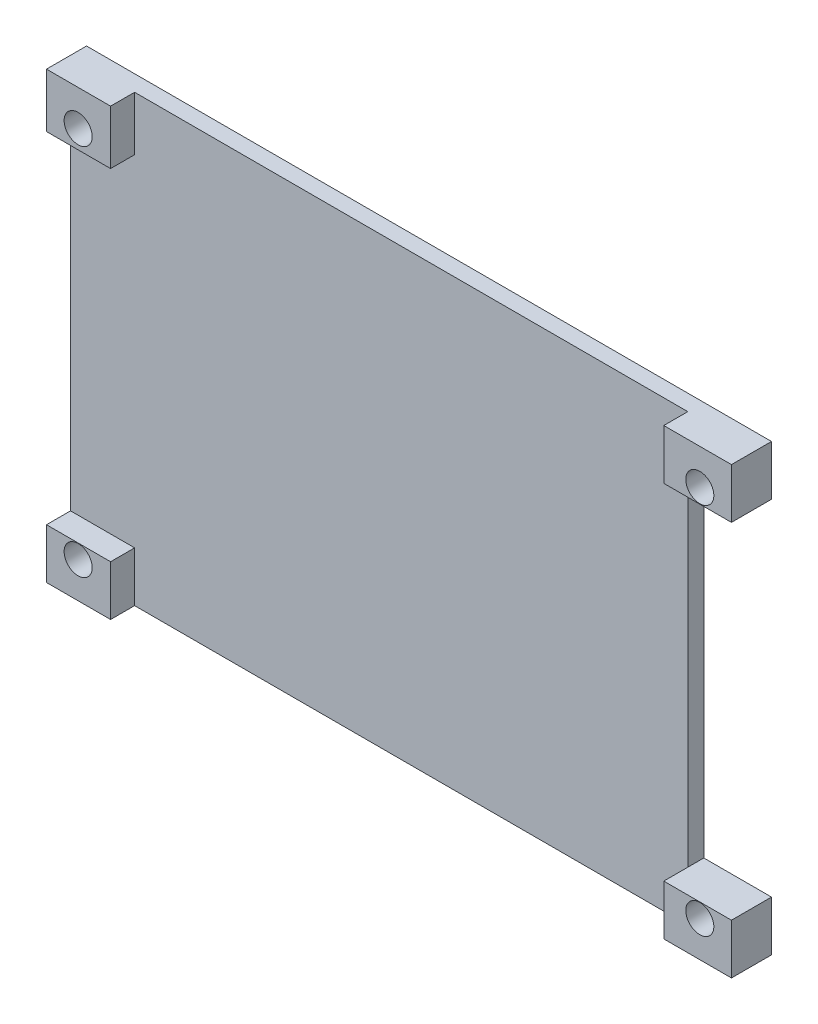
ISO-10303-21;
HEADER;
FILE_DESCRIPTION(('STEP AP214'),'2;1');
FILE_NAME('part.step','',(''),(''),'','','');
FILE_SCHEMA(('AUTOMOTIVE_DESIGN { 1 0 10303 214 1 1 1 1 }'));
ENDSEC;
DATA;
#1=APPLICATION_CONTEXT('core data for automotive mechanical design processes');
#2=APPLICATION_PROTOCOL_DEFINITION('international standard','automotive_design',2000,#1);
#3=PRODUCT_CONTEXT('',#1,'mechanical');
#4=PRODUCT('Part','Part','',(#3));
#5=PRODUCT_RELATED_PRODUCT_CATEGORY('part','',(#4));
#6=PRODUCT_DEFINITION_FORMATION('','',#4);
#7=PRODUCT_DEFINITION_CONTEXT('part definition',#1,'design');
#8=PRODUCT_DEFINITION('design','',#6,#7);
#9=PRODUCT_DEFINITION_SHAPE('','',#8);
#10=(LENGTH_UNIT() NAMED_UNIT(*) SI_UNIT(.MILLI.,.METRE.));
#11=(NAMED_UNIT(*) PLANE_ANGLE_UNIT() SI_UNIT($,.RADIAN.));
#12=(NAMED_UNIT(*) SI_UNIT($,.STERADIAN.) SOLID_ANGLE_UNIT());
#13=UNCERTAINTY_MEASURE_WITH_UNIT(LENGTH_MEASURE(1.E-05),#10,'distance_accuracy_value','');
#14=(GEOMETRIC_REPRESENTATION_CONTEXT(3) GLOBAL_UNCERTAINTY_ASSIGNED_CONTEXT((#13)) GLOBAL_UNIT_ASSIGNED_CONTEXT((#10,
#11,#12)) REPRESENTATION_CONTEXT('',''));
#15=CARTESIAN_POINT('',(0.,0.,0.));
#16=DIRECTION('',(0.,0.,1.));
#17=DIRECTION('',(1.,0.,0.));
#18=AXIS2_PLACEMENT_3D('',#15,#16,#17);
#19=CARTESIAN_POINT('',(0.,0.,2.));
#20=DIRECTION('',(0.,0.,-1.));
#21=DIRECTION('',(-1.,0.,0.));
#22=AXIS2_PLACEMENT_3D('',#19,#20,#21);
#23=PLANE('',#22);
#24=DIRECTION('',(0.,-1.,0.));
#25=VECTOR('',#24,1.);
#26=CARTESIAN_POINT('',(77.05,6.25,2.));
#27=LINE('',#26,#25);
#28=CARTESIAN_POINT('',(77.05,6.25,2.));
#29=VERTEX_POINT('',#28);
#30=CARTESIAN_POINT('',(77.05,0.,2.));
#31=VERTEX_POINT('',#30);
#32=EDGE_CURVE('E174',#29,#31,#27,.T.);
#33=ORIENTED_EDGE('',*,*,#32,.F.);
#34=DIRECTION('',(0.,1.,0.));
#35=VECTOR('',#34,1.);
#36=CARTESIAN_POINT('',(77.05,49.25,2.));
#37=LINE('',#36,#35);
#38=CARTESIAN_POINT('',(77.05,49.25,2.));
#39=VERTEX_POINT('',#38);
#40=EDGE_CURVE('E274',#29,#39,#37,.T.);
#41=ORIENTED_EDGE('',*,*,#40,.T.);
#42=DIRECTION('',(0.,-1.,0.));
#43=VECTOR('',#42,1.);
#44=CARTESIAN_POINT('',(77.05,49.25,2.));
#45=LINE('',#44,#43);
#46=CARTESIAN_POINT('',(77.05,55.5,2.));
#47=VERTEX_POINT('',#46);
#48=EDGE_CURVE('E181',#47,#39,#45,.T.);
#49=ORIENTED_EDGE('',*,*,#48,.F.);
#50=DIRECTION('',(-1.,0.,0.));
#51=VECTOR('',#50,1.);
#52=CARTESIAN_POINT('',(0.,55.5,2.));
#53=LINE('',#52,#51);
#54=CARTESIAN_POINT('',(8.,55.5,2.));
#55=VERTEX_POINT('',#54);
#56=EDGE_CURVE('E276',#47,#55,#53,.T.);
#57=ORIENTED_EDGE('',*,*,#56,.T.);
#58=DIRECTION('',(0.,1.,0.));
#59=VECTOR('',#58,1.);
#60=CARTESIAN_POINT('',(8.,55.5,2.));
#61=LINE('',#60,#59);
#62=CARTESIAN_POINT('',(8.,48.75,2.));
#63=VERTEX_POINT('',#62);
#64=EDGE_CURVE('E237',#63,#55,#61,.T.);
#65=ORIENTED_EDGE('',*,*,#64,.F.);
#66=DIRECTION('',(1.,0.,0.));
#67=VECTOR('',#66,1.);
#68=CARTESIAN_POINT('',(0.,48.75,2.));
#69=LINE('',#68,#67);
#70=CARTESIAN_POINT('',(0.,48.75,2.));
#71=VERTEX_POINT('',#70);
#72=EDGE_CURVE('E232',#71,#63,#69,.T.);
#73=ORIENTED_EDGE('',*,*,#72,.F.);
#74=DIRECTION('',(0.,-1.,0.));
#75=VECTOR('',#74,1.);
#76=CARTESIAN_POINT('',(0.,0.,2.));
#77=LINE('',#76,#75);
#78=CARTESIAN_POINT('',(0.,6.25,2.));
#79=VERTEX_POINT('',#78);
#80=EDGE_CURVE('E270',#71,#79,#77,.T.);
#81=ORIENTED_EDGE('',*,*,#80,.T.);
#82=DIRECTION('',(-1.,0.,0.));
#83=VECTOR('',#82,1.);
#84=CARTESIAN_POINT('',(0.,6.25,2.));
#85=LINE('',#84,#83);
#86=CARTESIAN_POINT('',(8.00000000000001,6.25,2.));
#87=VERTEX_POINT('',#86);
#88=EDGE_CURVE('E56',#87,#79,#85,.T.);
#89=ORIENTED_EDGE('',*,*,#88,.F.);
#90=DIRECTION('',(0.,1.,0.));
#91=VECTOR('',#90,1.);
#92=CARTESIAN_POINT('',(8.00000000000001,0.,2.));
#93=LINE('',#92,#91);
#94=CARTESIAN_POINT('',(8.00000000000001,0.,2.));
#95=VERTEX_POINT('',#94);
#96=EDGE_CURVE('E208',#95,#87,#93,.T.);
#97=ORIENTED_EDGE('',*,*,#96,.F.);
#98=DIRECTION('',(1.,0.,0.));
#99=VECTOR('',#98,1.);
#100=CARTESIAN_POINT('',(0.,0.,2.));
#101=LINE('',#100,#99);
#102=EDGE_CURVE('E50',#95,#31,#101,.T.);
#103=ORIENTED_EDGE('',*,*,#102,.T.);
#104=EDGE_LOOP('',(#33,#41,#49,#57,#65,#73,#81,#89,#97,#103));
#105=FACE_BOUND('',#104,.T.);
#106=ADVANCED_FACE('F35',(#105),#23,.F.);
#107=CARTESIAN_POINT('',(0.,0.,0.));
#108=DIRECTION('',(0.,0.,-1.));
#109=DIRECTION('',(-1.,0.,0.));
#110=AXIS2_PLACEMENT_3D('',#107,#108,#109);
#111=PLANE('',#110);
#112=CARTESIAN_POINT('',(3.95000000000001,4.45,0.));
#113=DIRECTION('',(0.,0.,1.));
#114=DIRECTION('',(1.,0.,0.));
#115=AXIS2_PLACEMENT_3D('',#112,#113,#114);
#116=CIRCLE('',#115,1.75);
#117=CARTESIAN_POINT('',(5.70000000000001,4.45,0.));
#118=VERTEX_POINT('',#117);
#119=EDGE_CURVE('E260',#118,#118,#116,.T.);
#120=ORIENTED_EDGE('',*,*,#119,.T.);
#121=EDGE_LOOP('',(#120));
#122=FACE_BOUND('',#121,.T.);
#123=CARTESIAN_POINT('',(3.95000000000001,51.05,0.));
#124=DIRECTION('',(0.,0.,1.));
#125=DIRECTION('',(1.,0.,0.));
#126=AXIS2_PLACEMENT_3D('',#123,#124,#125);
#127=CIRCLE('',#126,1.75);
#128=CARTESIAN_POINT('',(5.70000000000001,51.05,0.));
#129=VERTEX_POINT('',#128);
#130=EDGE_CURVE('E266',#129,#129,#127,.T.);
#131=ORIENTED_EDGE('',*,*,#130,.T.);
#132=EDGE_LOOP('',(#131));
#133=FACE_BOUND('',#132,.T.);
#134=DIRECTION('',(0.,-1.,0.));
#135=VECTOR('',#134,1.);
#136=CARTESIAN_POINT('',(0.,0.,0.));
#137=LINE('',#136,#135);
#138=CARTESIAN_POINT('',(0.,55.5,0.));
#139=VERTEX_POINT('',#138);
#140=CARTESIAN_POINT('',(0.,0.,0.));
#141=VERTEX_POINT('',#140);
#142=EDGE_CURVE('E269',#139,#141,#137,.T.);
#143=ORIENTED_EDGE('',*,*,#142,.F.);
#144=DIRECTION('',(-1.,0.,0.));
#145=VECTOR('',#144,1.);
#146=CARTESIAN_POINT('',(0.,55.5,0.));
#147=LINE('',#146,#145);
#148=CARTESIAN_POINT('',(85.5,55.5,0.));
#149=VERTEX_POINT('',#148);
#150=EDGE_CURVE('E272',#149,#139,#147,.T.);
#151=ORIENTED_EDGE('',*,*,#150,.F.);
#152=DIRECTION('',(0.,1.,0.));
#153=VECTOR('',#152,1.);
#154=CARTESIAN_POINT('',(85.5,49.25,0.));
#155=LINE('',#154,#153);
#156=CARTESIAN_POINT('',(85.5,49.25,0.));
#157=VERTEX_POINT('',#156);
#158=EDGE_CURVE('E291',#157,#149,#155,.T.);
#159=ORIENTED_EDGE('',*,*,#158,.F.);
#160=DIRECTION('',(1.,0.,0.));
#161=VECTOR('',#160,1.);
#162=CARTESIAN_POINT('',(85.5,49.25,0.));
#163=LINE('',#162,#161);
#164=CARTESIAN_POINT('',(77.05,49.25,0.));
#165=VERTEX_POINT('',#164);
#166=EDGE_CURVE('E289',#165,#157,#163,.T.);
#167=ORIENTED_EDGE('',*,*,#166,.F.);
#168=DIRECTION('',(0.,1.,0.));
#169=VECTOR('',#168,1.);
#170=CARTESIAN_POINT('',(77.05,49.25,0.));
#171=LINE('',#170,#169);
#172=CARTESIAN_POINT('',(77.05,6.25,0.));
#173=VERTEX_POINT('',#172);
#174=EDGE_CURVE('E287',#173,#165,#171,.T.);
#175=ORIENTED_EDGE('',*,*,#174,.F.);
#176=DIRECTION('',(-1.,0.,0.));
#177=VECTOR('',#176,1.);
#178=CARTESIAN_POINT('',(77.05,6.25,0.));
#179=LINE('',#178,#177);
#180=CARTESIAN_POINT('',(85.5,6.25,0.));
#181=VERTEX_POINT('',#180);
#182=EDGE_CURVE('E285',#181,#173,#179,.T.);
#183=ORIENTED_EDGE('',*,*,#182,.F.);
#184=DIRECTION('',(0.,1.,0.));
#185=VECTOR('',#184,1.);
#186=CARTESIAN_POINT('',(85.5,0.,0.));
#187=LINE('',#186,#185);
#188=CARTESIAN_POINT('',(85.5,0.,0.));
#189=VERTEX_POINT('',#188);
#190=EDGE_CURVE('E283',#189,#181,#187,.T.);
#191=ORIENTED_EDGE('',*,*,#190,.F.);
#192=DIRECTION('',(1.,0.,0.));
#193=VECTOR('',#192,1.);
#194=CARTESIAN_POINT('',(0.,0.,0.));
#195=LINE('',#194,#193);
#196=EDGE_CURVE('E281',#141,#189,#195,.T.);
#197=ORIENTED_EDGE('',*,*,#196,.F.);
#198=EDGE_LOOP('',(#143,#151,#159,#167,#175,#183,#191,#197));
#199=FACE_BOUND('',#198,.T.);
#200=CARTESIAN_POINT('',(81.55,51.05,0.));
#201=DIRECTION('',(0.,0.,1.));
#202=DIRECTION('',(1.,0.,0.));
#203=AXIS2_PLACEMENT_3D('',#200,#201,#202);
#204=CIRCLE('',#203,1.75);
#205=CARTESIAN_POINT('',(83.3,51.05,0.));
#206=VERTEX_POINT('',#205);
#207=EDGE_CURVE('E263',#206,#206,#204,.T.);
#208=ORIENTED_EDGE('',*,*,#207,.T.);
#209=EDGE_LOOP('',(#208));
#210=FACE_BOUND('',#209,.T.);
#211=CARTESIAN_POINT('',(81.55,4.45,0.));
#212=DIRECTION('',(0.,0.,1.));
#213=DIRECTION('',(1.,0.,0.));
#214=AXIS2_PLACEMENT_3D('',#211,#212,#213);
#215=CIRCLE('',#214,1.75);
#216=CARTESIAN_POINT('',(83.3,4.45,0.));
#217=VERTEX_POINT('',#216);
#218=EDGE_CURVE('E257',#217,#217,#215,.T.);
#219=ORIENTED_EDGE('',*,*,#218,.T.);
#220=EDGE_LOOP('',(#219));
#221=FACE_BOUND('',#220,.T.);
#222=ADVANCED_FACE('F316',(#122,#133,#199,#210,#221),#111,.T.);
#223=CARTESIAN_POINT('',(0.,0.,2.));
#224=DIRECTION('',(1.,0.,0.));
#225=DIRECTION('',(0.,0.,-1.));
#226=AXIS2_PLACEMENT_3D('',#223,#224,#225);
#227=PLANE('',#226);
#228=ORIENTED_EDGE('',*,*,#142,.T.);
#229=DIRECTION('',(0.,0.,-1.));
#230=VECTOR('',#229,1.);
#231=CARTESIAN_POINT('',(0.,0.,2.));
#232=LINE('',#231,#230);
#233=CARTESIAN_POINT('',(0.,0.,5.));
#234=VERTEX_POINT('',#233);
#235=EDGE_CURVE('E11',#234,#141,#232,.T.);
#236=ORIENTED_EDGE('',*,*,#235,.F.);
#237=DIRECTION('',(0.,-1.,0.));
#238=VECTOR('',#237,1.);
#239=CARTESIAN_POINT('',(0.,0.,5.));
#240=LINE('',#239,#238);
#241=CARTESIAN_POINT('',(0.,6.25,5.));
#242=VERTEX_POINT('',#241);
#243=EDGE_CURVE('E209',#242,#234,#240,.T.);
#244=ORIENTED_EDGE('',*,*,#243,.F.);
#245=DIRECTION('',(0.,0.,-1.));
#246=VECTOR('',#245,1.);
#247=CARTESIAN_POINT('',(0.,6.25,5.));
#248=LINE('',#247,#246);
#249=EDGE_CURVE('E218',#242,#79,#248,.T.);
#250=ORIENTED_EDGE('',*,*,#249,.T.);
#251=ORIENTED_EDGE('',*,*,#80,.F.);
#252=DIRECTION('',(0.,0.,-1.));
#253=VECTOR('',#252,1.);
#254=CARTESIAN_POINT('',(0.,48.75,5.));
#255=LINE('',#254,#253);
#256=CARTESIAN_POINT('',(0.,48.75,5.));
#257=VERTEX_POINT('',#256);
#258=EDGE_CURVE('E254',#257,#71,#255,.T.);
#259=ORIENTED_EDGE('',*,*,#258,.F.);
#260=DIRECTION('',(0.,-1.,0.));
#261=VECTOR('',#260,1.);
#262=CARTESIAN_POINT('',(0.,55.5,5.));
#263=LINE('',#262,#261);
#264=CARTESIAN_POINT('',(0.,55.5,5.));
#265=VERTEX_POINT('',#264);
#266=EDGE_CURVE('E233',#265,#257,#263,.T.);
#267=ORIENTED_EDGE('',*,*,#266,.F.);
#268=DIRECTION('',(0.,0.,-1.));
#269=VECTOR('',#268,1.);
#270=CARTESIAN_POINT('',(0.,55.5,2.));
#271=LINE('',#270,#269);
#272=EDGE_CURVE('E278',#265,#139,#271,.T.);
#273=ORIENTED_EDGE('',*,*,#272,.T.);
#274=EDGE_LOOP('',(#228,#236,#244,#250,#251,#259,#267,#273));
#275=FACE_BOUND('',#274,.T.);
#276=ADVANCED_FACE('F37',(#275),#227,.F.);
#277=CARTESIAN_POINT('',(0.,0.,2.));
#278=DIRECTION('',(0.,1.,0.));
#279=DIRECTION('',(0.,0.,1.));
#280=AXIS2_PLACEMENT_3D('',#277,#278,#279);
#281=PLANE('',#280);
#282=ORIENTED_EDGE('',*,*,#196,.T.);
#283=DIRECTION('',(0.,0.,-1.));
#284=VECTOR('',#283,1.);
#285=CARTESIAN_POINT('',(85.5,0.,2.));
#286=LINE('',#285,#284);
#287=CARTESIAN_POINT('',(85.5,0.,5.));
#288=VERTEX_POINT('',#287);
#289=EDGE_CURVE('E43',#288,#189,#286,.T.);
#290=ORIENTED_EDGE('',*,*,#289,.F.);
#291=DIRECTION('',(1.,0.,0.));
#292=VECTOR('',#291,1.);
#293=CARTESIAN_POINT('',(77.05,0.,5.));
#294=LINE('',#293,#292);
#295=CARTESIAN_POINT('',(77.05,0.,5.));
#296=VERTEX_POINT('',#295);
#297=EDGE_CURVE('E153',#296,#288,#294,.T.);
#298=ORIENTED_EDGE('',*,*,#297,.F.);
#299=DIRECTION('',(0.,0.,-1.));
#300=VECTOR('',#299,1.);
#301=CARTESIAN_POINT('',(77.05,0.,5.));
#302=LINE('',#301,#300);
#303=EDGE_CURVE('E157',#296,#31,#302,.T.);
#304=ORIENTED_EDGE('',*,*,#303,.T.);
#305=ORIENTED_EDGE('',*,*,#102,.F.);
#306=DIRECTION('',(0.,0.,-1.));
#307=VECTOR('',#306,1.);
#308=CARTESIAN_POINT('',(8.00000000000001,0.,5.));
#309=LINE('',#308,#307);
#310=CARTESIAN_POINT('',(8.00000000000001,0.,5.));
#311=VERTEX_POINT('',#310);
#312=EDGE_CURVE('E226',#311,#95,#309,.T.);
#313=ORIENTED_EDGE('',*,*,#312,.F.);
#314=DIRECTION('',(1.,0.,0.));
#315=VECTOR('',#314,1.);
#316=CARTESIAN_POINT('',(0.,0.,5.));
#317=LINE('',#316,#315);
#318=EDGE_CURVE('E212',#234,#311,#317,.T.);
#319=ORIENTED_EDGE('',*,*,#318,.F.);
#320=ORIENTED_EDGE('',*,*,#235,.T.);
#321=EDGE_LOOP('',(#282,#290,#298,#304,#305,#313,#319,#320));
#322=FACE_BOUND('',#321,.T.);
#323=ADVANCED_FACE('F155',(#322),#281,.F.);
#324=CARTESIAN_POINT('',(85.5,0.,2.));
#325=DIRECTION('',(-1.,0.,0.));
#326=DIRECTION('',(0.,0.,1.));
#327=AXIS2_PLACEMENT_3D('',#324,#325,#326);
#328=PLANE('',#327);
#329=ORIENTED_EDGE('',*,*,#190,.T.);
#330=DIRECTION('',(0.,0.,-1.));
#331=VECTOR('',#330,1.);
#332=CARTESIAN_POINT('',(85.5,6.25,2.));
#333=LINE('',#332,#331);
#334=CARTESIAN_POINT('',(85.5,6.25,5.));
#335=VERTEX_POINT('',#334);
#336=EDGE_CURVE('E308',#335,#181,#333,.T.);
#337=ORIENTED_EDGE('',*,*,#336,.F.);
#338=DIRECTION('',(0.,1.,0.));
#339=VECTOR('',#338,1.);
#340=CARTESIAN_POINT('',(85.5,6.25,5.));
#341=LINE('',#340,#339);
#342=EDGE_CURVE('E163',#288,#335,#341,.T.);
#343=ORIENTED_EDGE('',*,*,#342,.F.);
#344=ORIENTED_EDGE('',*,*,#289,.T.);
#345=EDGE_LOOP('',(#329,#337,#343,#344));
#346=FACE_BOUND('',#345,.T.);
#347=ADVANCED_FACE('F312',(#346),#328,.F.);
#348=CARTESIAN_POINT('',(77.05,6.25,2.));
#349=DIRECTION('',(0.,-1.,0.));
#350=DIRECTION('',(0.,0.,-1.));
#351=AXIS2_PLACEMENT_3D('',#348,#349,#350);
#352=PLANE('',#351);
#353=ORIENTED_EDGE('',*,*,#182,.T.);
#354=DIRECTION('',(0.,0.,-1.));
#355=VECTOR('',#354,1.);
#356=CARTESIAN_POINT('',(77.05,6.25,2.));
#357=LINE('',#356,#355);
#358=EDGE_CURVE('E305',#29,#173,#357,.T.);
#359=ORIENTED_EDGE('',*,*,#358,.F.);
#360=DIRECTION('',(0.,0.,-1.));
#361=VECTOR('',#360,1.);
#362=CARTESIAN_POINT('',(77.05,6.25,5.));
#363=LINE('',#362,#361);
#364=CARTESIAN_POINT('',(77.05,6.25,5.));
#365=VERTEX_POINT('',#364);
#366=EDGE_CURVE('E178',#365,#29,#363,.T.);
#367=ORIENTED_EDGE('',*,*,#366,.F.);
#368=DIRECTION('',(-1.,0.,0.));
#369=VECTOR('',#368,1.);
#370=CARTESIAN_POINT('',(77.05,6.25,5.));
#371=LINE('',#370,#369);
#372=EDGE_CURVE('E170',#335,#365,#371,.T.);
#373=ORIENTED_EDGE('',*,*,#372,.F.);
#374=ORIENTED_EDGE('',*,*,#336,.T.);
#375=EDGE_LOOP('',(#353,#359,#367,#373,#374));
#376=FACE_BOUND('',#375,.T.);
#377=ADVANCED_FACE('F322',(#376),#352,.F.);
#378=CARTESIAN_POINT('',(77.05,49.25,2.));
#379=DIRECTION('',(-1.,0.,0.));
#380=DIRECTION('',(0.,0.,1.));
#381=AXIS2_PLACEMENT_3D('',#378,#379,#380);
#382=PLANE('',#381);
#383=ORIENTED_EDGE('',*,*,#174,.T.);
#384=DIRECTION('',(0.,0.,-1.));
#385=VECTOR('',#384,1.);
#386=CARTESIAN_POINT('',(77.05,49.25,2.));
#387=LINE('',#386,#385);
#388=EDGE_CURVE('E302',#39,#165,#387,.T.);
#389=ORIENTED_EDGE('',*,*,#388,.F.);
#390=ORIENTED_EDGE('',*,*,#40,.F.);
#391=ORIENTED_EDGE('',*,*,#358,.T.);
#392=EDGE_LOOP('',(#383,#389,#390,#391));
#393=FACE_BOUND('',#392,.T.);
#394=ADVANCED_FACE('F324',(#393),#382,.F.);
#395=CARTESIAN_POINT('',(85.5,49.25,2.));
#396=DIRECTION('',(0.,1.,0.));
#397=DIRECTION('',(0.,0.,1.));
#398=AXIS2_PLACEMENT_3D('',#395,#396,#397);
#399=PLANE('',#398);
#400=ORIENTED_EDGE('',*,*,#166,.T.);
#401=DIRECTION('',(0.,0.,-1.));
#402=VECTOR('',#401,1.);
#403=CARTESIAN_POINT('',(85.5,49.25,2.));
#404=LINE('',#403,#402);
#405=CARTESIAN_POINT('',(85.5,49.25,5.));
#406=VERTEX_POINT('',#405);
#407=EDGE_CURVE('E299',#406,#157,#404,.T.);
#408=ORIENTED_EDGE('',*,*,#407,.F.);
#409=DIRECTION('',(1.,0.,0.));
#410=VECTOR('',#409,1.);
#411=CARTESIAN_POINT('',(77.05,49.25,5.));
#412=LINE('',#411,#410);
#413=CARTESIAN_POINT('',(77.05,49.25,5.));
#414=VERTEX_POINT('',#413);
#415=EDGE_CURVE('E189',#414,#406,#412,.T.);
#416=ORIENTED_EDGE('',*,*,#415,.F.);
#417=DIRECTION('',(0.,0.,-1.));
#418=VECTOR('',#417,1.);
#419=CARTESIAN_POINT('',(77.05,49.25,5.));
#420=LINE('',#419,#418);
#421=EDGE_CURVE('E202',#414,#39,#420,.T.);
#422=ORIENTED_EDGE('',*,*,#421,.T.);
#423=ORIENTED_EDGE('',*,*,#388,.T.);
#424=EDGE_LOOP('',(#400,#408,#416,#422,#423));
#425=FACE_BOUND('',#424,.T.);
#426=ADVANCED_FACE('F364',(#425),#399,.F.);
#427=CARTESIAN_POINT('',(85.5,49.25,2.));
#428=DIRECTION('',(-1.,0.,0.));
#429=DIRECTION('',(0.,0.,1.));
#430=AXIS2_PLACEMENT_3D('',#427,#428,#429);
#431=PLANE('',#430);
#432=ORIENTED_EDGE('',*,*,#158,.T.);
#433=DIRECTION('',(0.,0.,-1.));
#434=VECTOR('',#433,1.);
#435=CARTESIAN_POINT('',(85.5,55.5,2.));
#436=LINE('',#435,#434);
#437=CARTESIAN_POINT('',(85.5,55.5,5.));
#438=VERTEX_POINT('',#437);
#439=EDGE_CURVE('E296',#438,#149,#436,.T.);
#440=ORIENTED_EDGE('',*,*,#439,.F.);
#441=DIRECTION('',(0.,1.,0.));
#442=VECTOR('',#441,1.);
#443=CARTESIAN_POINT('',(85.5,49.25,5.));
#444=LINE('',#443,#442);
#445=EDGE_CURVE('E192',#406,#438,#444,.T.);
#446=ORIENTED_EDGE('',*,*,#445,.F.);
#447=ORIENTED_EDGE('',*,*,#407,.T.);
#448=EDGE_LOOP('',(#432,#440,#446,#447));
#449=FACE_BOUND('',#448,.T.);
#450=ADVANCED_FACE('F360',(#449),#431,.F.);
#451=CARTESIAN_POINT('',(0.,55.5,2.));
#452=DIRECTION('',(0.,-1.,0.));
#453=DIRECTION('',(0.,0.,-1.));
#454=AXIS2_PLACEMENT_3D('',#451,#452,#453);
#455=PLANE('',#454);
#456=ORIENTED_EDGE('',*,*,#150,.T.);
#457=ORIENTED_EDGE('',*,*,#272,.F.);
#458=DIRECTION('',(-1.,0.,0.));
#459=VECTOR('',#458,1.);
#460=CARTESIAN_POINT('',(0.,55.5,5.));
#461=LINE('',#460,#459);
#462=CARTESIAN_POINT('',(8.,55.5,5.));
#463=VERTEX_POINT('',#462);
#464=EDGE_CURVE('E241',#463,#265,#461,.T.);
#465=ORIENTED_EDGE('',*,*,#464,.F.);
#466=DIRECTION('',(0.,0.,-1.));
#467=VECTOR('',#466,1.);
#468=CARTESIAN_POINT('',(8.,55.5,5.));
#469=LINE('',#468,#467);
#470=EDGE_CURVE('E244',#463,#55,#469,.T.);
#471=ORIENTED_EDGE('',*,*,#470,.T.);
#472=ORIENTED_EDGE('',*,*,#56,.F.);
#473=DIRECTION('',(0.,0.,-1.));
#474=VECTOR('',#473,1.);
#475=CARTESIAN_POINT('',(77.05,55.5,5.));
#476=LINE('',#475,#474);
#477=CARTESIAN_POINT('',(77.05,55.5,5.));
#478=VERTEX_POINT('',#477);
#479=EDGE_CURVE('E197',#478,#47,#476,.T.);
#480=ORIENTED_EDGE('',*,*,#479,.F.);
#481=DIRECTION('',(-1.,0.,0.));
#482=VECTOR('',#481,1.);
#483=CARTESIAN_POINT('',(77.05,55.5,5.));
#484=LINE('',#483,#482);
#485=EDGE_CURVE('E195',#438,#478,#484,.T.);
#486=ORIENTED_EDGE('',*,*,#485,.F.);
#487=ORIENTED_EDGE('',*,*,#439,.T.);
#488=EDGE_LOOP('',(#456,#457,#465,#471,#472,#480,#486,#487));
#489=FACE_BOUND('',#488,.T.);
#490=ADVANCED_FACE('F357',(#489),#455,.F.);
#491=CARTESIAN_POINT('',(3.95000000000001,51.05,2.));
#492=DIRECTION('',(0.,0.,-1.));
#493=DIRECTION('',(-1.,0.,0.));
#494=AXIS2_PLACEMENT_3D('',#491,#492,#493);
#495=CYLINDRICAL_SURFACE('',#494,1.75);
#496=ORIENTED_EDGE('',*,*,#130,.F.);
#497=EDGE_LOOP('',(#496));
#498=FACE_BOUND('',#497,.T.);
#499=CARTESIAN_POINT('',(3.95000000000001,51.05,5.));
#500=DIRECTION('',(0.,0.,1.));
#501=DIRECTION('',(1.,0.,0.));
#502=AXIS2_PLACEMENT_3D('',#499,#500,#501);
#503=CIRCLE('',#502,1.75);
#504=CARTESIAN_POINT('',(5.70000000000001,51.05,5.));
#505=VERTEX_POINT('',#504);
#506=EDGE_CURVE('E229',#505,#505,#503,.T.);
#507=ORIENTED_EDGE('',*,*,#506,.T.);
#508=EDGE_LOOP('',(#507));
#509=FACE_BOUND('',#508,.T.);
#510=ADVANCED_FACE('F354',(#498,#509),#495,.F.);
#511=CARTESIAN_POINT('',(81.55,51.05,2.));
#512=DIRECTION('',(0.,0.,-1.));
#513=DIRECTION('',(-1.,0.,0.));
#514=AXIS2_PLACEMENT_3D('',#511,#512,#513);
#515=CYLINDRICAL_SURFACE('',#514,1.75);
#516=ORIENTED_EDGE('',*,*,#207,.F.);
#517=EDGE_LOOP('',(#516));
#518=FACE_BOUND('',#517,.T.);
#519=CARTESIAN_POINT('',(81.55,51.05,5.));
#520=DIRECTION('',(0.,0.,1.));
#521=DIRECTION('',(1.,0.,0.));
#522=AXIS2_PLACEMENT_3D('',#519,#520,#521);
#523=CIRCLE('',#522,1.75);
#524=CARTESIAN_POINT('',(83.3,51.05,5.));
#525=VERTEX_POINT('',#524);
#526=EDGE_CURVE('E177',#525,#525,#523,.T.);
#527=ORIENTED_EDGE('',*,*,#526,.T.);
#528=EDGE_LOOP('',(#527));
#529=FACE_BOUND('',#528,.T.);
#530=ADVANCED_FACE('F421',(#518,#529),#515,.F.);
#531=CARTESIAN_POINT('',(3.95000000000001,4.45,2.));
#532=DIRECTION('',(0.,0.,-1.));
#533=DIRECTION('',(-1.,0.,0.));
#534=AXIS2_PLACEMENT_3D('',#531,#532,#533);
#535=CYLINDRICAL_SURFACE('',#534,1.75);
#536=ORIENTED_EDGE('',*,*,#119,.F.);
#537=EDGE_LOOP('',(#536));
#538=FACE_BOUND('',#537,.T.);
#539=CARTESIAN_POINT('',(3.95000000000001,4.45,5.));
#540=DIRECTION('',(0.,0.,1.));
#541=DIRECTION('',(1.,0.,0.));
#542=AXIS2_PLACEMENT_3D('',#539,#540,#541);
#543=CIRCLE('',#542,1.75);
#544=CARTESIAN_POINT('',(5.70000000000001,4.45,5.));
#545=VERTEX_POINT('',#544);
#546=EDGE_CURVE('E205',#545,#545,#543,.T.);
#547=ORIENTED_EDGE('',*,*,#546,.T.);
#548=EDGE_LOOP('',(#547));
#549=FACE_BOUND('',#548,.T.);
#550=ADVANCED_FACE('F419',(#538,#549),#535,.F.);
#551=CARTESIAN_POINT('',(81.55,4.45,2.));
#552=DIRECTION('',(0.,0.,-1.));
#553=DIRECTION('',(-1.,0.,0.));
#554=AXIS2_PLACEMENT_3D('',#551,#552,#553);
#555=CYLINDRICAL_SURFACE('',#554,1.75);
#556=ORIENTED_EDGE('',*,*,#218,.F.);
#557=EDGE_LOOP('',(#556));
#558=FACE_BOUND('',#557,.T.);
#559=CARTESIAN_POINT('',(81.55,4.45,5.));
#560=DIRECTION('',(0.,0.,1.));
#561=DIRECTION('',(1.,0.,0.));
#562=AXIS2_PLACEMENT_3D('',#559,#560,#561);
#563=CIRCLE('',#562,1.75);
#564=CARTESIAN_POINT('',(83.3,4.45,5.));
#565=VERTEX_POINT('',#564);
#566=EDGE_CURVE('E327',#565,#565,#563,.T.);
#567=ORIENTED_EDGE('',*,*,#566,.T.);
#568=EDGE_LOOP('',(#567));
#569=FACE_BOUND('',#568,.T.);
#570=ADVANCED_FACE('F334',(#558,#569),#555,.F.);
#571=CARTESIAN_POINT('',(0.,0.,5.));
#572=DIRECTION('',(0.,0.,1.));
#573=DIRECTION('',(1.,0.,0.));
#574=AXIS2_PLACEMENT_3D('',#571,#572,#573);
#575=PLANE('',#574);
#576=ORIENTED_EDGE('',*,*,#266,.T.);
#577=DIRECTION('',(1.,0.,0.));
#578=VECTOR('',#577,1.);
#579=CARTESIAN_POINT('',(0.,48.75,5.));
#580=LINE('',#579,#578);
#581=CARTESIAN_POINT('',(8.,48.75,5.));
#582=VERTEX_POINT('',#581);
#583=EDGE_CURVE('E236',#257,#582,#580,.T.);
#584=ORIENTED_EDGE('',*,*,#583,.T.);
#585=DIRECTION('',(0.,1.,0.));
#586=VECTOR('',#585,1.);
#587=CARTESIAN_POINT('',(8.,55.5,5.));
#588=LINE('',#587,#586);
#589=EDGE_CURVE('E239',#582,#463,#588,.T.);
#590=ORIENTED_EDGE('',*,*,#589,.T.);
#591=ORIENTED_EDGE('',*,*,#464,.T.);
#592=EDGE_LOOP('',(#576,#584,#590,#591));
#593=FACE_BOUND('',#592,.T.);
#594=ORIENTED_EDGE('',*,*,#506,.F.);
#595=EDGE_LOOP('',(#594));
#596=FACE_BOUND('',#595,.T.);
#597=ADVANCED_FACE('F428',(#593,#596),#575,.T.);
#598=CARTESIAN_POINT('',(0.,48.75,5.));
#599=DIRECTION('',(0.,1.,0.));
#600=DIRECTION('',(0.,0.,1.));
#601=AXIS2_PLACEMENT_3D('',#598,#599,#600);
#602=PLANE('',#601);
#603=ORIENTED_EDGE('',*,*,#72,.T.);
#604=DIRECTION('',(0.,0.,-1.));
#605=VECTOR('',#604,1.);
#606=CARTESIAN_POINT('',(8.,48.75,5.));
#607=LINE('',#606,#605);
#608=EDGE_CURVE('E251',#582,#63,#607,.T.);
#609=ORIENTED_EDGE('',*,*,#608,.F.);
#610=ORIENTED_EDGE('',*,*,#583,.F.);
#611=ORIENTED_EDGE('',*,*,#258,.T.);
#612=EDGE_LOOP('',(#603,#609,#610,#611));
#613=FACE_BOUND('',#612,.T.);
#614=ADVANCED_FACE('F400',(#613),#602,.F.);
#615=CARTESIAN_POINT('',(8.,55.5,5.));
#616=DIRECTION('',(-1.,0.,0.));
#617=DIRECTION('',(0.,0.,1.));
#618=AXIS2_PLACEMENT_3D('',#615,#616,#617);
#619=PLANE('',#618);
#620=ORIENTED_EDGE('',*,*,#64,.T.);
#621=ORIENTED_EDGE('',*,*,#470,.F.);
#622=ORIENTED_EDGE('',*,*,#589,.F.);
#623=ORIENTED_EDGE('',*,*,#608,.T.);
#624=EDGE_LOOP('',(#620,#621,#622,#623));
#625=FACE_BOUND('',#624,.T.);
#626=ADVANCED_FACE('F396',(#625),#619,.F.);
#627=CARTESIAN_POINT('',(0.,0.,5.));
#628=DIRECTION('',(0.,0.,-1.));
#629=DIRECTION('',(-1.,0.,0.));
#630=AXIS2_PLACEMENT_3D('',#627,#628,#629);
#631=PLANE('',#630);
#632=ORIENTED_EDGE('',*,*,#243,.T.);
#633=ORIENTED_EDGE('',*,*,#318,.T.);
#634=DIRECTION('',(0.,1.,0.));
#635=VECTOR('',#634,1.);
#636=CARTESIAN_POINT('',(8.00000000000001,0.,5.));
#637=LINE('',#636,#635);
#638=CARTESIAN_POINT('',(8.00000000000001,6.25,5.));
#639=VERTEX_POINT('',#638);
#640=EDGE_CURVE('E214',#311,#639,#637,.T.);
#641=ORIENTED_EDGE('',*,*,#640,.T.);
#642=DIRECTION('',(-1.,0.,0.));
#643=VECTOR('',#642,1.);
#644=CARTESIAN_POINT('',(0.,6.25,5.));
#645=LINE('',#644,#643);
#646=EDGE_CURVE('E216',#639,#242,#645,.T.);
#647=ORIENTED_EDGE('',*,*,#646,.T.);
#648=EDGE_LOOP('',(#632,#633,#641,#647));
#649=FACE_BOUND('',#648,.T.);
#650=ORIENTED_EDGE('',*,*,#546,.F.);
#651=EDGE_LOOP('',(#650));
#652=FACE_BOUND('',#651,.T.);
#653=ADVANCED_FACE('F413',(#649,#652),#631,.F.);
#654=CARTESIAN_POINT('',(8.00000000000001,0.,5.));
#655=DIRECTION('',(-1.,0.,0.));
#656=DIRECTION('',(0.,0.,1.));
#657=AXIS2_PLACEMENT_3D('',#654,#655,#656);
#658=PLANE('',#657);
#659=ORIENTED_EDGE('',*,*,#96,.T.);
#660=DIRECTION('',(0.,0.,-1.));
#661=VECTOR('',#660,1.);
#662=CARTESIAN_POINT('',(8.00000000000001,6.25,5.));
#663=LINE('',#662,#661);
#664=EDGE_CURVE('E223',#639,#87,#663,.T.);
#665=ORIENTED_EDGE('',*,*,#664,.F.);
#666=ORIENTED_EDGE('',*,*,#640,.F.);
#667=ORIENTED_EDGE('',*,*,#312,.T.);
#668=EDGE_LOOP('',(#659,#665,#666,#667));
#669=FACE_BOUND('',#668,.T.);
#670=ADVANCED_FACE('F410',(#669),#658,.F.);
#671=CARTESIAN_POINT('',(0.,6.25,5.));
#672=DIRECTION('',(0.,-1.,0.));
#673=DIRECTION('',(0.,0.,-1.));
#674=AXIS2_PLACEMENT_3D('',#671,#672,#673);
#675=PLANE('',#674);
#676=ORIENTED_EDGE('',*,*,#88,.T.);
#677=ORIENTED_EDGE('',*,*,#249,.F.);
#678=ORIENTED_EDGE('',*,*,#646,.F.);
#679=ORIENTED_EDGE('',*,*,#664,.T.);
#680=EDGE_LOOP('',(#676,#677,#678,#679));
#681=FACE_BOUND('',#680,.T.);
#682=ADVANCED_FACE('F406',(#681),#675,.F.);
#683=CARTESIAN_POINT('',(0.,0.,5.));
#684=DIRECTION('',(0.,0.,-1.));
#685=DIRECTION('',(-1.,0.,0.));
#686=AXIS2_PLACEMENT_3D('',#683,#684,#685);
#687=PLANE('',#686);
#688=DIRECTION('',(0.,-1.,0.));
#689=VECTOR('',#688,1.);
#690=CARTESIAN_POINT('',(77.05,49.25,5.));
#691=LINE('',#690,#689);
#692=EDGE_CURVE('E186',#478,#414,#691,.T.);
#693=ORIENTED_EDGE('',*,*,#692,.T.);
#694=ORIENTED_EDGE('',*,*,#415,.T.);
#695=ORIENTED_EDGE('',*,*,#445,.T.);
#696=ORIENTED_EDGE('',*,*,#485,.T.);
#697=EDGE_LOOP('',(#693,#694,#695,#696));
#698=FACE_BOUND('',#697,.T.);
#699=ORIENTED_EDGE('',*,*,#526,.F.);
#700=EDGE_LOOP('',(#699));
#701=FACE_BOUND('',#700,.T.);
#702=ADVANCED_FACE('F343',(#698,#701),#687,.F.);
#703=CARTESIAN_POINT('',(77.05,49.25,5.));
#704=DIRECTION('',(1.,0.,0.));
#705=DIRECTION('',(0.,0.,-1.));
#706=AXIS2_PLACEMENT_3D('',#703,#704,#705);
#707=PLANE('',#706);
#708=ORIENTED_EDGE('',*,*,#48,.T.);
#709=ORIENTED_EDGE('',*,*,#421,.F.);
#710=ORIENTED_EDGE('',*,*,#692,.F.);
#711=ORIENTED_EDGE('',*,*,#479,.T.);
#712=EDGE_LOOP('',(#708,#709,#710,#711));
#713=FACE_BOUND('',#712,.T.);
#714=ADVANCED_FACE('F336',(#713),#707,.F.);
#715=CARTESIAN_POINT('',(0.,0.,5.));
#716=DIRECTION('',(0.,0.,1.));
#717=DIRECTION('',(1.,0.,0.));
#718=AXIS2_PLACEMENT_3D('',#715,#716,#717);
#719=PLANE('',#718);
#720=DIRECTION('',(0.,-1.,0.));
#721=VECTOR('',#720,1.);
#722=CARTESIAN_POINT('',(77.05,6.25,5.));
#723=LINE('',#722,#721);
#724=EDGE_CURVE('E164',#365,#296,#723,.T.);
#725=ORIENTED_EDGE('',*,*,#724,.T.);
#726=ORIENTED_EDGE('',*,*,#297,.T.);
#727=ORIENTED_EDGE('',*,*,#342,.T.);
#728=ORIENTED_EDGE('',*,*,#372,.T.);
#729=EDGE_LOOP('',(#725,#726,#727,#728));
#730=FACE_BOUND('',#729,.T.);
#731=ORIENTED_EDGE('',*,*,#566,.F.);
#732=EDGE_LOOP('',(#731));
#733=FACE_BOUND('',#732,.T.);
#734=ADVANCED_FACE('F167',(#730,#733),#719,.T.);
#735=CARTESIAN_POINT('',(77.05,6.25,5.));
#736=DIRECTION('',(1.,0.,0.));
#737=DIRECTION('',(0.,0.,-1.));
#738=AXIS2_PLACEMENT_3D('',#735,#736,#737);
#739=PLANE('',#738);
#740=ORIENTED_EDGE('',*,*,#32,.T.);
#741=ORIENTED_EDGE('',*,*,#303,.F.);
#742=ORIENTED_EDGE('',*,*,#724,.F.);
#743=ORIENTED_EDGE('',*,*,#366,.T.);
#744=EDGE_LOOP('',(#740,#741,#742,#743));
#745=FACE_BOUND('',#744,.T.);
#746=ADVANCED_FACE('F176',(#745),#739,.F.);
#747=CLOSED_SHELL('',(#106,#222,#276,#323,#347,#377,#394,#426,#450,#490,#510,#530,#550,#570,
#597,#614,#626,#653,#670,#682,#702,#714,#734,#746));
#748=MANIFOLD_SOLID_BREP('B2',#747);
#749=ADVANCED_BREP_SHAPE_REPRESENTATION('',(#18,#748),#14);
#750=SHAPE_DEFINITION_REPRESENTATION(#9,#749);
ENDSEC;
END-ISO-10303-21;
